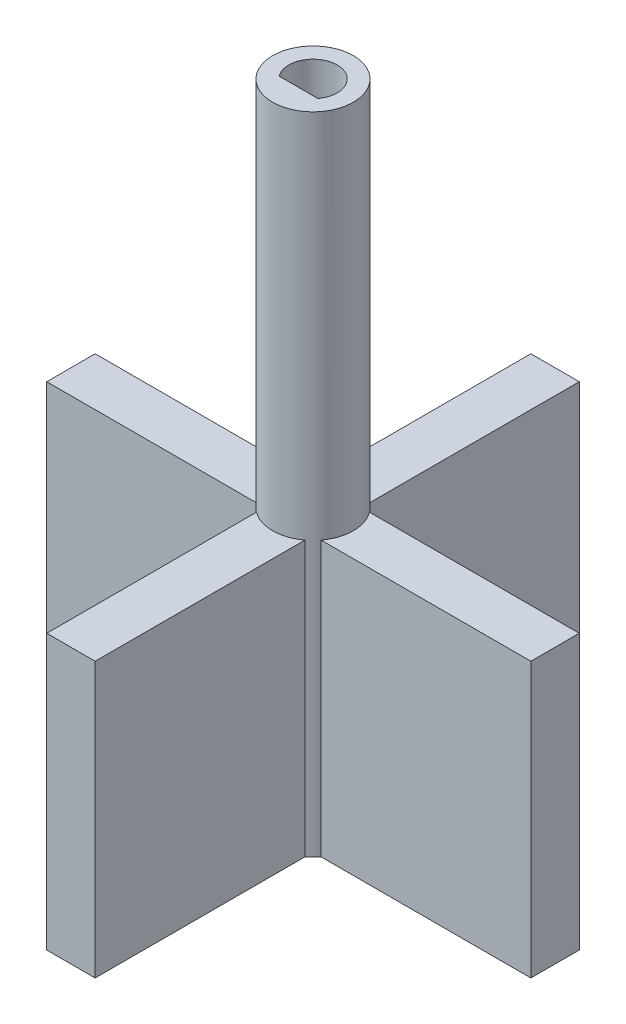
ISO-10303-21;
HEADER;
FILE_DESCRIPTION(('STEP AP214'),'2;1');
FILE_NAME('part.step','',(''),(''),'','','');
FILE_SCHEMA(('AUTOMOTIVE_DESIGN { 1 0 10303 214 1 1 1 1 }'));
ENDSEC;
DATA;
#1=APPLICATION_CONTEXT('core data for automotive mechanical design processes');
#2=APPLICATION_PROTOCOL_DEFINITION('international standard','automotive_design',2000,#1);
#3=PRODUCT_CONTEXT('',#1,'mechanical');
#4=PRODUCT('Part','Part','',(#3));
#5=PRODUCT_RELATED_PRODUCT_CATEGORY('part','',(#4));
#6=PRODUCT_DEFINITION_FORMATION('','',#4);
#7=PRODUCT_DEFINITION_CONTEXT('part definition',#1,'design');
#8=PRODUCT_DEFINITION('design','',#6,#7);
#9=PRODUCT_DEFINITION_SHAPE('','',#8);
#10=(LENGTH_UNIT() NAMED_UNIT(*) SI_UNIT(.MILLI.,.METRE.));
#11=(NAMED_UNIT(*) PLANE_ANGLE_UNIT() SI_UNIT($,.RADIAN.));
#12=(NAMED_UNIT(*) SI_UNIT($,.STERADIAN.) SOLID_ANGLE_UNIT());
#13=UNCERTAINTY_MEASURE_WITH_UNIT(LENGTH_MEASURE(1.E-05),#10,'distance_accuracy_value','');
#14=(GEOMETRIC_REPRESENTATION_CONTEXT(3) GLOBAL_UNCERTAINTY_ASSIGNED_CONTEXT((#13)) GLOBAL_UNIT_ASSIGNED_CONTEXT((#10,
#11,#12)) REPRESENTATION_CONTEXT('',''));
#15=CARTESIAN_POINT('',(0.,0.,0.));
#16=DIRECTION('',(0.,0.,1.));
#17=DIRECTION('',(1.,0.,0.));
#18=AXIS2_PLACEMENT_3D('',#15,#16,#17);
#19=CARTESIAN_POINT('',(0.,17.,0.));
#20=DIRECTION('',(0.,1.,0.));
#21=DIRECTION('',(0.,0.,1.));
#22=AXIS2_PLACEMENT_3D('',#19,#20,#21);
#23=PLANE('',#22);
#24=DIRECTION('',(1.,0.,0.));
#25=VECTOR('',#24,1.);
#26=CARTESIAN_POINT('',(0.,17.,0.6));
#27=LINE('',#26,#25);
#28=CARTESIAN_POINT('',(-15.,17.,0.600000000000001));
#29=VERTEX_POINT('',#28);
#30=CARTESIAN_POINT('',(-2.,17.,0.6));
#31=VERTEX_POINT('',#30);
#32=EDGE_CURVE('E191',#29,#31,#27,.T.);
#33=ORIENTED_EDGE('',*,*,#32,.T.);
#34=CARTESIAN_POINT('',(0.,17.,-0.9));
#35=DIRECTION('',(0.,1.,0.));
#36=DIRECTION('',(0.,0.,1.));
#37=AXIS2_PLACEMENT_3D('',#34,#35,#36);
#38=CIRCLE('',#37,2.5);
#39=CARTESIAN_POINT('',(-2.,17.,-2.4));
#40=VERTEX_POINT('',#39);
#41=EDGE_CURVE('E174',#31,#40,#38,.F.);
#42=ORIENTED_EDGE('',*,*,#41,.T.);
#43=DIRECTION('',(1.,0.,0.));
#44=VECTOR('',#43,1.);
#45=CARTESIAN_POINT('',(0.,17.,-2.4));
#46=LINE('',#45,#44);
#47=CARTESIAN_POINT('',(-15.,17.,-2.4));
#48=VERTEX_POINT('',#47);
#49=EDGE_CURVE('E353',#48,#40,#46,.T.);
#50=ORIENTED_EDGE('',*,*,#49,.F.);
#51=DIRECTION('',(0.,0.,1.));
#52=VECTOR('',#51,1.);
#53=CARTESIAN_POINT('',(-15.,17.,0.));
#54=LINE('',#53,#52);
#55=EDGE_CURVE('E197',#48,#29,#54,.T.);
#56=ORIENTED_EDGE('',*,*,#55,.T.);
#57=EDGE_LOOP('',(#33,#42,#50,#56));
#58=FACE_BOUND('',#57,.T.);
#59=ADVANCED_FACE('F45',(#58),#23,.T.);
#60=DIRECTION('',(0.,0.,-1.));
#61=VECTOR('',#60,1.);
#62=CARTESIAN_POINT('',(-1.5,17.,0.));
#63=LINE('',#62,#61);
#64=CARTESIAN_POINT('',(-1.5,17.,-2.9));
#65=VERTEX_POINT('',#64);
#66=CARTESIAN_POINT('',(-1.5,17.,-15.9));
#67=VERTEX_POINT('',#66);
#68=EDGE_CURVE('E349',#65,#67,#63,.T.);
#69=ORIENTED_EDGE('',*,*,#68,.F.);
#70=CARTESIAN_POINT('',(1.5,17.,-2.9));
#71=VERTEX_POINT('',#70);
#72=EDGE_CURVE('E391',#65,#71,#38,.F.);
#73=ORIENTED_EDGE('',*,*,#72,.T.);
#74=DIRECTION('',(0.,0.,-1.));
#75=VECTOR('',#74,1.);
#76=CARTESIAN_POINT('',(1.5,17.,0.));
#77=LINE('',#76,#75);
#78=CARTESIAN_POINT('',(1.5,17.,-15.9));
#79=VERTEX_POINT('',#78);
#80=EDGE_CURVE('E339',#71,#79,#77,.T.);
#81=ORIENTED_EDGE('',*,*,#80,.T.);
#82=DIRECTION('',(1.,0.,0.));
#83=VECTOR('',#82,1.);
#84=CARTESIAN_POINT('',(0.,17.,-15.9));
#85=LINE('',#84,#83);
#86=EDGE_CURVE('E342',#67,#79,#85,.T.);
#87=ORIENTED_EDGE('',*,*,#86,.F.);
#88=EDGE_LOOP('',(#69,#73,#81,#87));
#89=FACE_BOUND('',#88,.T.);
#90=ADVANCED_FACE('F436',(#89),#23,.T.);
#91=DIRECTION('',(1.,0.,0.));
#92=VECTOR('',#91,1.);
#93=CARTESIAN_POINT('',(0.,17.,-2.4));
#94=LINE('',#93,#92);
#95=CARTESIAN_POINT('',(2.,17.,-2.4));
#96=VERTEX_POINT('',#95);
#97=CARTESIAN_POINT('',(15.,17.,-2.4));
#98=VERTEX_POINT('',#97);
#99=EDGE_CURVE('E333',#96,#98,#94,.T.);
#100=ORIENTED_EDGE('',*,*,#99,.F.);
#101=CARTESIAN_POINT('',(2.,17.,0.6));
#102=VERTEX_POINT('',#101);
#103=EDGE_CURVE('E171',#96,#102,#38,.F.);
#104=ORIENTED_EDGE('',*,*,#103,.T.);
#105=DIRECTION('',(1.,0.,0.));
#106=VECTOR('',#105,1.);
#107=CARTESIAN_POINT('',(0.,17.,0.6));
#108=LINE('',#107,#106);
#109=CARTESIAN_POINT('',(15.,17.,0.599999999999999));
#110=VERTEX_POINT('',#109);
#111=EDGE_CURVE('E139',#102,#110,#108,.T.);
#112=ORIENTED_EDGE('',*,*,#111,.T.);
#113=DIRECTION('',(0.,0.,1.));
#114=VECTOR('',#113,1.);
#115=CARTESIAN_POINT('',(15.,17.,0.));
#116=LINE('',#115,#114);
#117=EDGE_CURVE('E327',#98,#110,#116,.T.);
#118=ORIENTED_EDGE('',*,*,#117,.F.);
#119=EDGE_LOOP('',(#100,#104,#112,#118));
#120=FACE_BOUND('',#119,.T.);
#121=ADVANCED_FACE('F331',(#120),#23,.T.);
#122=DIRECTION('',(0.,0.,-1.));
#123=VECTOR('',#122,1.);
#124=CARTESIAN_POINT('',(1.5,17.,0.));
#125=LINE('',#124,#123);
#126=CARTESIAN_POINT('',(1.5,17.,14.1));
#127=VERTEX_POINT('',#126);
#128=CARTESIAN_POINT('',(1.5,17.,1.1));
#129=VERTEX_POINT('',#128);
#130=EDGE_CURVE('E166',#127,#129,#125,.T.);
#131=ORIENTED_EDGE('',*,*,#130,.T.);
#132=CARTESIAN_POINT('',(-1.5,17.,1.1));
#133=VERTEX_POINT('',#132);
#134=EDGE_CURVE('E159',#129,#133,#38,.F.);
#135=ORIENTED_EDGE('',*,*,#134,.T.);
#136=DIRECTION('',(0.,0.,-1.));
#137=VECTOR('',#136,1.);
#138=CARTESIAN_POINT('',(-1.5,17.,0.));
#139=LINE('',#138,#137);
#140=CARTESIAN_POINT('',(-1.5,17.,14.1));
#141=VERTEX_POINT('',#140);
#142=EDGE_CURVE('E163',#141,#133,#139,.T.);
#143=ORIENTED_EDGE('',*,*,#142,.F.);
#144=DIRECTION('',(1.,0.,0.));
#145=VECTOR('',#144,1.);
#146=CARTESIAN_POINT('',(0.,17.,14.1));
#147=LINE('',#146,#145);
#148=EDGE_CURVE('E65',#141,#127,#147,.T.);
#149=ORIENTED_EDGE('',*,*,#148,.T.);
#150=EDGE_LOOP('',(#131,#135,#143,#149));
#151=FACE_BOUND('',#150,.T.);
#152=ADVANCED_FACE('F161',(#151),#23,.T.);
#153=CARTESIAN_POINT('',(0.,17.,-0.9));
#154=DIRECTION('',(0.,-1.,0.));
#155=DIRECTION('',(0.,0.,-1.));
#156=AXIS2_PLACEMENT_3D('',#153,#154,#155);
#157=CYLINDRICAL_SURFACE('',#156,1.5);
#158=CARTESIAN_POINT('',(0.,0.,-0.9));
#159=DIRECTION('',(0.,1.,0.));
#160=DIRECTION('',(0.,0.,1.));
#161=AXIS2_PLACEMENT_3D('',#158,#159,#160);
#162=CIRCLE('',#161,1.5);
#163=CARTESIAN_POINT('',(1.2,0.,0.));
#164=VERTEX_POINT('',#163);
#165=CARTESIAN_POINT('',(-1.2,0.,0.));
#166=VERTEX_POINT('',#165);
#167=EDGE_CURVE('E260',#164,#166,#162,.T.);
#168=ORIENTED_EDGE('',*,*,#167,.F.);
#169=DIRECTION('',(0.,-1.,0.));
#170=VECTOR('',#169,1.);
#171=CARTESIAN_POINT('',(1.2,17.,0.));
#172=LINE('',#171,#170);
#173=CARTESIAN_POINT('',(1.2,40.,0.));
#174=VERTEX_POINT('',#173);
#175=EDGE_CURVE('E11',#174,#164,#172,.T.);
#176=ORIENTED_EDGE('',*,*,#175,.F.);
#177=CARTESIAN_POINT('',(0.,40.,-0.9));
#178=DIRECTION('',(0.,1.,0.));
#179=DIRECTION('',(0.,0.,1.));
#180=AXIS2_PLACEMENT_3D('',#177,#178,#179);
#181=CIRCLE('',#180,1.5);
#182=CARTESIAN_POINT('',(-1.2,40.,0.));
#183=VERTEX_POINT('',#182);
#184=EDGE_CURVE('E417',#174,#183,#181,.T.);
#185=ORIENTED_EDGE('',*,*,#184,.T.);
#186=DIRECTION('',(0.,-1.,0.));
#187=VECTOR('',#186,1.);
#188=CARTESIAN_POINT('',(-1.2,17.,0.));
#189=LINE('',#188,#187);
#190=EDGE_CURVE('E56',#183,#166,#189,.T.);
#191=ORIENTED_EDGE('',*,*,#190,.T.);
#192=EDGE_LOOP('',(#168,#176,#185,#191));
#193=FACE_BOUND('',#192,.T.);
#194=ADVANCED_FACE('F445',(#193),#157,.F.);
#195=CARTESIAN_POINT('',(0.,17.,0.6));
#196=DIRECTION('',(0.,0.,-1.));
#197=DIRECTION('',(-1.,0.,0.));
#198=AXIS2_PLACEMENT_3D('',#195,#196,#197);
#199=PLANE('',#198);
#200=DIRECTION('',(1.,0.,0.));
#201=VECTOR('',#200,1.);
#202=CARTESIAN_POINT('',(0.,0.,0.6));
#203=LINE('',#202,#201);
#204=CARTESIAN_POINT('',(2.,0.,0.6));
#205=VERTEX_POINT('',#204);
#206=CARTESIAN_POINT('',(15.,0.,0.599999999999999));
#207=VERTEX_POINT('',#206);
#208=EDGE_CURVE('E208',#205,#207,#203,.T.);
#209=ORIENTED_EDGE('',*,*,#208,.T.);
#210=DIRECTION('',(0.,-1.,0.));
#211=VECTOR('',#210,1.);
#212=CARTESIAN_POINT('',(15.,17.,0.599999999999999));
#213=LINE('',#212,#211);
#214=EDGE_CURVE('E307',#110,#207,#213,.T.);
#215=ORIENTED_EDGE('',*,*,#214,.F.);
#216=ORIENTED_EDGE('',*,*,#111,.F.);
#217=DIRECTION('',(0.,-1.,0.));
#218=VECTOR('',#217,1.);
#219=CARTESIAN_POINT('',(2.,17.,0.6));
#220=LINE('',#219,#218);
#221=EDGE_CURVE('E49',#102,#205,#220,.T.);
#222=ORIENTED_EDGE('',*,*,#221,.T.);
#223=EDGE_LOOP('',(#209,#215,#216,#222));
#224=FACE_BOUND('',#223,.T.);
#225=ADVANCED_FACE('F47',(#224),#199,.F.);
#226=CARTESIAN_POINT('',(15.,17.,0.));
#227=DIRECTION('',(1.,0.,0.));
#228=DIRECTION('',(0.,0.,-1.));
#229=AXIS2_PLACEMENT_3D('',#226,#227,#228);
#230=PLANE('',#229);
#231=DIRECTION('',(0.,0.,1.));
#232=VECTOR('',#231,1.);
#233=CARTESIAN_POINT('',(15.,0.,0.));
#234=LINE('',#233,#232);
#235=CARTESIAN_POINT('',(15.,0.,-2.4));
#236=VERTEX_POINT('',#235);
#237=EDGE_CURVE('E212',#236,#207,#234,.T.);
#238=ORIENTED_EDGE('',*,*,#237,.F.);
#239=DIRECTION('',(0.,-1.,0.));
#240=VECTOR('',#239,1.);
#241=CARTESIAN_POINT('',(15.,17.,-2.4));
#242=LINE('',#241,#240);
#243=EDGE_CURVE('E305',#98,#236,#242,.T.);
#244=ORIENTED_EDGE('',*,*,#243,.F.);
#245=ORIENTED_EDGE('',*,*,#117,.T.);
#246=ORIENTED_EDGE('',*,*,#214,.T.);
#247=EDGE_LOOP('',(#238,#244,#245,#246));
#248=FACE_BOUND('',#247,.T.);
#249=ADVANCED_FACE('F326',(#248),#230,.T.);
#250=CARTESIAN_POINT('',(0.,17.,-2.4));
#251=DIRECTION('',(0.,0.,-1.));
#252=DIRECTION('',(-1.,0.,0.));
#253=AXIS2_PLACEMENT_3D('',#250,#251,#252);
#254=PLANE('',#253);
#255=DIRECTION('',(1.,0.,0.));
#256=VECTOR('',#255,1.);
#257=CARTESIAN_POINT('',(0.,0.,-2.4));
#258=LINE('',#257,#256);
#259=CARTESIAN_POINT('',(2.,0.,-2.4));
#260=VERTEX_POINT('',#259);
#261=EDGE_CURVE('E216',#260,#236,#258,.T.);
#262=ORIENTED_EDGE('',*,*,#261,.F.);
#263=DIRECTION('',(0.,-1.,0.));
#264=VECTOR('',#263,1.);
#265=CARTESIAN_POINT('',(2.,17.,-2.4));
#266=LINE('',#265,#264);
#267=EDGE_CURVE('E302',#96,#260,#266,.T.);
#268=ORIENTED_EDGE('',*,*,#267,.F.);
#269=ORIENTED_EDGE('',*,*,#99,.T.);
#270=ORIENTED_EDGE('',*,*,#243,.T.);
#271=EDGE_LOOP('',(#262,#268,#269,#270));
#272=FACE_BOUND('',#271,.T.);
#273=ADVANCED_FACE('F337',(#272),#254,.T.);
#274=CARTESIAN_POINT('',(1.5,17.,0.));
#275=DIRECTION('',(-1.,0.,0.));
#276=DIRECTION('',(0.,0.,1.));
#277=AXIS2_PLACEMENT_3D('',#274,#275,#276);
#278=PLANE('',#277);
#279=DIRECTION('',(0.,0.,-1.));
#280=VECTOR('',#279,1.);
#281=CARTESIAN_POINT('',(1.5,0.,0.));
#282=LINE('',#281,#280);
#283=CARTESIAN_POINT('',(1.5,0.,-2.9));
#284=VERTEX_POINT('',#283);
#285=CARTESIAN_POINT('',(1.5,0.,-15.9));
#286=VERTEX_POINT('',#285);
#287=EDGE_CURVE('E223',#284,#286,#282,.T.);
#288=ORIENTED_EDGE('',*,*,#287,.T.);
#289=DIRECTION('',(0.,-1.,0.));
#290=VECTOR('',#289,1.);
#291=CARTESIAN_POINT('',(1.5,17.,-15.9));
#292=LINE('',#291,#290);
#293=EDGE_CURVE('E295',#79,#286,#292,.T.);
#294=ORIENTED_EDGE('',*,*,#293,.F.);
#295=ORIENTED_EDGE('',*,*,#80,.F.);
#296=DIRECTION('',(0.,-1.,0.));
#297=VECTOR('',#296,1.);
#298=CARTESIAN_POINT('',(1.5,17.,-2.9));
#299=LINE('',#298,#297);
#300=EDGE_CURVE('E298',#71,#284,#299,.T.);
#301=ORIENTED_EDGE('',*,*,#300,.T.);
#302=EDGE_LOOP('',(#288,#294,#295,#301));
#303=FACE_BOUND('',#302,.T.);
#304=ADVANCED_FACE('F408',(#303),#278,.F.);
#305=CARTESIAN_POINT('',(0.,17.,-15.9));
#306=DIRECTION('',(0.,0.,-1.));
#307=DIRECTION('',(-1.,0.,0.));
#308=AXIS2_PLACEMENT_3D('',#305,#306,#307);
#309=PLANE('',#308);
#310=DIRECTION('',(1.,0.,0.));
#311=VECTOR('',#310,1.);
#312=CARTESIAN_POINT('',(0.,0.,-15.9));
#313=LINE('',#312,#311);
#314=CARTESIAN_POINT('',(-1.5,0.,-15.9));
#315=VERTEX_POINT('',#314);
#316=EDGE_CURVE('E227',#315,#286,#313,.T.);
#317=ORIENTED_EDGE('',*,*,#316,.F.);
#318=DIRECTION('',(0.,-1.,0.));
#319=VECTOR('',#318,1.);
#320=CARTESIAN_POINT('',(-1.5,17.,-15.9));
#321=LINE('',#320,#319);
#322=EDGE_CURVE('E292',#67,#315,#321,.T.);
#323=ORIENTED_EDGE('',*,*,#322,.F.);
#324=ORIENTED_EDGE('',*,*,#86,.T.);
#325=ORIENTED_EDGE('',*,*,#293,.T.);
#326=EDGE_LOOP('',(#317,#323,#324,#325));
#327=FACE_BOUND('',#326,.T.);
#328=ADVANCED_FACE('F404',(#327),#309,.T.);
#329=CARTESIAN_POINT('',(-1.5,17.,0.));
#330=DIRECTION('',(-1.,0.,0.));
#331=DIRECTION('',(0.,0.,1.));
#332=AXIS2_PLACEMENT_3D('',#329,#330,#331);
#333=PLANE('',#332);
#334=DIRECTION('',(0.,0.,-1.));
#335=VECTOR('',#334,1.);
#336=CARTESIAN_POINT('',(-1.5,0.,0.));
#337=LINE('',#336,#335);
#338=CARTESIAN_POINT('',(-1.5,0.,-2.9));
#339=VERTEX_POINT('',#338);
#340=EDGE_CURVE('E231',#339,#315,#337,.T.);
#341=ORIENTED_EDGE('',*,*,#340,.F.);
#342=DIRECTION('',(0.,-1.,0.));
#343=VECTOR('',#342,1.);
#344=CARTESIAN_POINT('',(-1.5,17.,-2.9));
#345=LINE('',#344,#343);
#346=EDGE_CURVE('E289',#65,#339,#345,.T.);
#347=ORIENTED_EDGE('',*,*,#346,.F.);
#348=ORIENTED_EDGE('',*,*,#68,.T.);
#349=ORIENTED_EDGE('',*,*,#322,.T.);
#350=EDGE_LOOP('',(#341,#347,#348,#349));
#351=FACE_BOUND('',#350,.T.);
#352=ADVANCED_FACE('F399',(#351),#333,.T.);
#353=CARTESIAN_POINT('',(0.,17.,-2.4));
#354=DIRECTION('',(0.,0.,-1.));
#355=DIRECTION('',(-1.,0.,0.));
#356=AXIS2_PLACEMENT_3D('',#353,#354,#355);
#357=PLANE('',#356);
#358=DIRECTION('',(1.,0.,0.));
#359=VECTOR('',#358,1.);
#360=CARTESIAN_POINT('',(0.,0.,-2.4));
#361=LINE('',#360,#359);
#362=CARTESIAN_POINT('',(-15.,0.,-2.4));
#363=VERTEX_POINT('',#362);
#364=CARTESIAN_POINT('',(-2.,0.,-2.4));
#365=VERTEX_POINT('',#364);
#366=EDGE_CURVE('E239',#363,#365,#361,.T.);
#367=ORIENTED_EDGE('',*,*,#366,.F.);
#368=DIRECTION('',(0.,-1.,0.));
#369=VECTOR('',#368,1.);
#370=CARTESIAN_POINT('',(-15.,17.,-2.4));
#371=LINE('',#370,#369);
#372=EDGE_CURVE('E283',#48,#363,#371,.T.);
#373=ORIENTED_EDGE('',*,*,#372,.F.);
#374=ORIENTED_EDGE('',*,*,#49,.T.);
#375=DIRECTION('',(0.,-1.,0.));
#376=VECTOR('',#375,1.);
#377=CARTESIAN_POINT('',(-2.,17.,-2.4));
#378=LINE('',#377,#376);
#379=EDGE_CURVE('E286',#40,#365,#378,.T.);
#380=ORIENTED_EDGE('',*,*,#379,.T.);
#381=EDGE_LOOP('',(#367,#373,#374,#380));
#382=FACE_BOUND('',#381,.T.);
#383=ADVANCED_FACE('F395',(#382),#357,.T.);
#384=CARTESIAN_POINT('',(-15.,17.,0.));
#385=DIRECTION('',(1.,0.,0.));
#386=DIRECTION('',(0.,0.,-1.));
#387=AXIS2_PLACEMENT_3D('',#384,#385,#386);
#388=PLANE('',#387);
#389=DIRECTION('',(0.,0.,1.));
#390=VECTOR('',#389,1.);
#391=CARTESIAN_POINT('',(-15.,0.,0.));
#392=LINE('',#391,#390);
#393=CARTESIAN_POINT('',(-15.,0.,0.600000000000001));
#394=VERTEX_POINT('',#393);
#395=EDGE_CURVE('E243',#363,#394,#392,.T.);
#396=ORIENTED_EDGE('',*,*,#395,.T.);
#397=DIRECTION('',(0.,-1.,0.));
#398=VECTOR('',#397,1.);
#399=CARTESIAN_POINT('',(-15.,17.,0.600000000000001));
#400=LINE('',#399,#398);
#401=EDGE_CURVE('E279',#29,#394,#400,.T.);
#402=ORIENTED_EDGE('',*,*,#401,.F.);
#403=ORIENTED_EDGE('',*,*,#55,.F.);
#404=ORIENTED_EDGE('',*,*,#372,.T.);
#405=EDGE_LOOP('',(#396,#402,#403,#404));
#406=FACE_BOUND('',#405,.T.);
#407=ADVANCED_FACE('F365',(#406),#388,.F.);
#408=CARTESIAN_POINT('',(0.,17.,0.6));
#409=DIRECTION('',(0.,0.,-1.));
#410=DIRECTION('',(-1.,0.,0.));
#411=AXIS2_PLACEMENT_3D('',#408,#409,#410);
#412=PLANE('',#411);
#413=DIRECTION('',(1.,0.,0.));
#414=VECTOR('',#413,1.);
#415=CARTESIAN_POINT('',(0.,0.,0.6));
#416=LINE('',#415,#414);
#417=CARTESIAN_POINT('',(-2.,0.,0.6));
#418=VERTEX_POINT('',#417);
#419=EDGE_CURVE('E246',#394,#418,#416,.T.);
#420=ORIENTED_EDGE('',*,*,#419,.T.);
#421=DIRECTION('',(0.,-1.,0.));
#422=VECTOR('',#421,1.);
#423=CARTESIAN_POINT('',(-2.,17.,0.6));
#424=LINE('',#423,#422);
#425=EDGE_CURVE('E186',#31,#418,#424,.T.);
#426=ORIENTED_EDGE('',*,*,#425,.F.);
#427=ORIENTED_EDGE('',*,*,#32,.F.);
#428=ORIENTED_EDGE('',*,*,#401,.T.);
#429=EDGE_LOOP('',(#420,#426,#427,#428));
#430=FACE_BOUND('',#429,.T.);
#431=ADVANCED_FACE('F369',(#430),#412,.F.);
#432=CARTESIAN_POINT('',(0.,17.,-0.9));
#433=DIRECTION('',(0.,-1.,0.));
#434=DIRECTION('',(0.,0.,-1.));
#435=AXIS2_PLACEMENT_3D('',#432,#433,#434);
#436=CYLINDRICAL_SURFACE('',#435,2.5);
#437=CARTESIAN_POINT('',(0.,0.,-0.9));
#438=DIRECTION('',(0.,1.,0.));
#439=DIRECTION('',(0.,0.,1.));
#440=AXIS2_PLACEMENT_3D('',#437,#438,#439);
#441=CIRCLE('',#440,2.5);
#442=CARTESIAN_POINT('',(-1.5,0.,1.1));
#443=VERTEX_POINT('',#442);
#444=EDGE_CURVE('E181',#418,#443,#441,.T.);
#445=ORIENTED_EDGE('',*,*,#444,.T.);
#446=DIRECTION('',(0.,-1.,0.));
#447=VECTOR('',#446,1.);
#448=CARTESIAN_POINT('',(-1.5,17.,1.1));
#449=LINE('',#448,#447);
#450=EDGE_CURVE('E176',#133,#443,#449,.T.);
#451=ORIENTED_EDGE('',*,*,#450,.F.);
#452=ORIENTED_EDGE('',*,*,#134,.F.);
#453=DIRECTION('',(0.,-1.,0.));
#454=VECTOR('',#453,1.);
#455=CARTESIAN_POINT('',(1.5,17.,1.1));
#456=LINE('',#455,#454);
#457=CARTESIAN_POINT('',(1.5,0.,1.1));
#458=VERTEX_POINT('',#457);
#459=EDGE_CURVE('E203',#129,#458,#456,.T.);
#460=ORIENTED_EDGE('',*,*,#459,.T.);
#461=CARTESIAN_POINT('',(0.,0.,-0.9));
#462=DIRECTION('',(0.,1.,0.));
#463=DIRECTION('',(0.,0.,1.));
#464=AXIS2_PLACEMENT_3D('',#461,#462,#463);
#465=CIRCLE('',#464,2.5);
#466=EDGE_CURVE('E204',#458,#205,#465,.T.);
#467=ORIENTED_EDGE('',*,*,#466,.T.);
#468=ORIENTED_EDGE('',*,*,#221,.F.);
#469=ORIENTED_EDGE('',*,*,#103,.F.);
#470=ORIENTED_EDGE('',*,*,#267,.T.);
#471=CARTESIAN_POINT('',(0.,0.,-0.9));
#472=DIRECTION('',(0.,1.,0.));
#473=DIRECTION('',(0.,0.,1.));
#474=AXIS2_PLACEMENT_3D('',#471,#472,#473);
#475=CIRCLE('',#474,2.5);
#476=EDGE_CURVE('E220',#260,#284,#475,.T.);
#477=ORIENTED_EDGE('',*,*,#476,.T.);
#478=ORIENTED_EDGE('',*,*,#300,.F.);
#479=ORIENTED_EDGE('',*,*,#72,.F.);
#480=ORIENTED_EDGE('',*,*,#346,.T.);
#481=CARTESIAN_POINT('',(0.,0.,-0.9));
#482=DIRECTION('',(0.,1.,0.));
#483=DIRECTION('',(0.,0.,1.));
#484=AXIS2_PLACEMENT_3D('',#481,#482,#483);
#485=CIRCLE('',#484,2.5);
#486=EDGE_CURVE('E235',#339,#365,#485,.T.);
#487=ORIENTED_EDGE('',*,*,#486,.T.);
#488=ORIENTED_EDGE('',*,*,#379,.F.);
#489=ORIENTED_EDGE('',*,*,#41,.F.);
#490=ORIENTED_EDGE('',*,*,#425,.T.);
#491=EDGE_LOOP('',(#445,#451,#452,#460,#467,#468,#469,#470,#477,#478,#479,#480,#487,#488,#489,#490));
#492=FACE_BOUND('',#491,.T.);
#493=CARTESIAN_POINT('',(0.,40.,-0.9));
#494=DIRECTION('',(0.,1.,0.));
#495=DIRECTION('',(0.,0.,1.));
#496=AXIS2_PLACEMENT_3D('',#493,#494,#495);
#497=CIRCLE('',#496,2.5);
#498=CARTESIAN_POINT('',(0.,40.,1.6));
#499=VERTEX_POINT('',#498);
#500=EDGE_CURVE('E420',#499,#499,#497,.T.);
#501=ORIENTED_EDGE('',*,*,#500,.F.);
#502=EDGE_LOOP('',(#501));
#503=FACE_BOUND('',#502,.T.);
#504=ADVANCED_FACE('F177',(#492,#503),#436,.T.);
#505=CARTESIAN_POINT('',(-1.5,17.,0.));
#506=DIRECTION('',(-1.,0.,0.));
#507=DIRECTION('',(0.,0.,1.));
#508=AXIS2_PLACEMENT_3D('',#505,#506,#507);
#509=PLANE('',#508);
#510=DIRECTION('',(0.,0.,-1.));
#511=VECTOR('',#510,1.);
#512=CARTESIAN_POINT('',(-1.5,0.,0.));
#513=LINE('',#512,#511);
#514=CARTESIAN_POINT('',(-1.5,0.,14.1));
#515=VERTEX_POINT('',#514);
#516=EDGE_CURVE('E251',#515,#443,#513,.T.);
#517=ORIENTED_EDGE('',*,*,#516,.F.);
#518=DIRECTION('',(0.,-1.,0.));
#519=VECTOR('',#518,1.);
#520=CARTESIAN_POINT('',(-1.5,17.,14.1));
#521=LINE('',#520,#519);
#522=EDGE_CURVE('E187',#141,#515,#521,.T.);
#523=ORIENTED_EDGE('',*,*,#522,.F.);
#524=ORIENTED_EDGE('',*,*,#142,.T.);
#525=ORIENTED_EDGE('',*,*,#450,.T.);
#526=EDGE_LOOP('',(#517,#523,#524,#525));
#527=FACE_BOUND('',#526,.T.);
#528=ADVANCED_FACE('F189',(#527),#509,.T.);
#529=CARTESIAN_POINT('',(0.,17.,14.1));
#530=DIRECTION('',(0.,0.,-1.));
#531=DIRECTION('',(-1.,0.,0.));
#532=AXIS2_PLACEMENT_3D('',#529,#530,#531);
#533=PLANE('',#532);
#534=DIRECTION('',(1.,0.,0.));
#535=VECTOR('',#534,1.);
#536=CARTESIAN_POINT('',(0.,0.,14.1));
#537=LINE('',#536,#535);
#538=CARTESIAN_POINT('',(1.5,0.,14.1));
#539=VERTEX_POINT('',#538);
#540=EDGE_CURVE('E254',#515,#539,#537,.T.);
#541=ORIENTED_EDGE('',*,*,#540,.T.);
#542=DIRECTION('',(0.,-1.,0.));
#543=VECTOR('',#542,1.);
#544=CARTESIAN_POINT('',(1.5,17.,14.1));
#545=LINE('',#544,#543);
#546=EDGE_CURVE('E271',#127,#539,#545,.T.);
#547=ORIENTED_EDGE('',*,*,#546,.F.);
#548=ORIENTED_EDGE('',*,*,#148,.F.);
#549=ORIENTED_EDGE('',*,*,#522,.T.);
#550=EDGE_LOOP('',(#541,#547,#548,#549));
#551=FACE_BOUND('',#550,.T.);
#552=ADVANCED_FACE('F374',(#551),#533,.F.);
#553=CARTESIAN_POINT('',(1.5,17.,0.));
#554=DIRECTION('',(-1.,0.,0.));
#555=DIRECTION('',(0.,0.,1.));
#556=AXIS2_PLACEMENT_3D('',#553,#554,#555);
#557=PLANE('',#556);
#558=DIRECTION('',(0.,0.,-1.));
#559=VECTOR('',#558,1.);
#560=CARTESIAN_POINT('',(1.5,0.,0.));
#561=LINE('',#560,#559);
#562=EDGE_CURVE('E257',#539,#458,#561,.T.);
#563=ORIENTED_EDGE('',*,*,#562,.T.);
#564=ORIENTED_EDGE('',*,*,#459,.F.);
#565=ORIENTED_EDGE('',*,*,#130,.F.);
#566=ORIENTED_EDGE('',*,*,#546,.T.);
#567=EDGE_LOOP('',(#563,#564,#565,#566));
#568=FACE_BOUND('',#567,.T.);
#569=ADVANCED_FACE('F376',(#568),#557,.F.);
#570=CARTESIAN_POINT('',(0.,17.,0.));
#571=DIRECTION('',(0.,0.,-1.));
#572=DIRECTION('',(-1.,0.,0.));
#573=AXIS2_PLACEMENT_3D('',#570,#571,#572);
#574=PLANE('',#573);
#575=DIRECTION('',(1.,0.,0.));
#576=VECTOR('',#575,1.);
#577=CARTESIAN_POINT('',(0.,0.,0.));
#578=LINE('',#577,#576);
#579=EDGE_CURVE('E263',#166,#164,#578,.T.);
#580=ORIENTED_EDGE('',*,*,#579,.F.);
#581=ORIENTED_EDGE('',*,*,#190,.F.);
#582=DIRECTION('',(1.,0.,0.));
#583=VECTOR('',#582,1.);
#584=CARTESIAN_POINT('',(0.,40.,0.));
#585=LINE('',#584,#583);
#586=EDGE_CURVE('E172',#183,#174,#585,.T.);
#587=ORIENTED_EDGE('',*,*,#586,.T.);
#588=ORIENTED_EDGE('',*,*,#175,.T.);
#589=EDGE_LOOP('',(#580,#581,#587,#588));
#590=FACE_BOUND('',#589,.T.);
#591=ADVANCED_FACE('F565',(#590),#574,.T.);
#592=CARTESIAN_POINT('',(0.,0.,0.));
#593=DIRECTION('',(0.,1.,0.));
#594=DIRECTION('',(0.,0.,1.));
#595=AXIS2_PLACEMENT_3D('',#592,#593,#594);
#596=PLANE('',#595);
#597=ORIENTED_EDGE('',*,*,#444,.F.);
#598=ORIENTED_EDGE('',*,*,#419,.F.);
#599=ORIENTED_EDGE('',*,*,#395,.F.);
#600=ORIENTED_EDGE('',*,*,#366,.T.);
#601=ORIENTED_EDGE('',*,*,#486,.F.);
#602=ORIENTED_EDGE('',*,*,#340,.T.);
#603=ORIENTED_EDGE('',*,*,#316,.T.);
#604=ORIENTED_EDGE('',*,*,#287,.F.);
#605=ORIENTED_EDGE('',*,*,#476,.F.);
#606=ORIENTED_EDGE('',*,*,#261,.T.);
#607=ORIENTED_EDGE('',*,*,#237,.T.);
#608=ORIENTED_EDGE('',*,*,#208,.F.);
#609=ORIENTED_EDGE('',*,*,#466,.F.);
#610=ORIENTED_EDGE('',*,*,#562,.F.);
#611=ORIENTED_EDGE('',*,*,#540,.F.);
#612=ORIENTED_EDGE('',*,*,#516,.T.);
#613=EDGE_LOOP('',(#597,#598,#599,#600,#601,#602,#603,#604,#605,#606,#607,#608,#609,#610,#611,#612));
#614=FACE_BOUND('',#613,.T.);
#615=ORIENTED_EDGE('',*,*,#167,.T.);
#616=ORIENTED_EDGE('',*,*,#579,.T.);
#617=EDGE_LOOP('',(#615,#616));
#618=FACE_BOUND('',#617,.T.);
#619=ADVANCED_FACE('F321',(#614,#618),#596,.F.);
#620=CARTESIAN_POINT('',(0.,40.,0.));
#621=DIRECTION('',(0.,1.,0.));
#622=DIRECTION('',(0.,0.,1.));
#623=AXIS2_PLACEMENT_3D('',#620,#621,#622);
#624=PLANE('',#623);
#625=ORIENTED_EDGE('',*,*,#500,.T.);
#626=EDGE_LOOP('',(#625));
#627=FACE_BOUND('',#626,.T.);
#628=ORIENTED_EDGE('',*,*,#184,.F.);
#629=ORIENTED_EDGE('',*,*,#586,.F.);
#630=EDGE_LOOP('',(#628,#629));
#631=FACE_BOUND('',#630,.T.);
#632=ADVANCED_FACE('F425',(#627,#631),#624,.T.);
#633=CLOSED_SHELL('',(#59,#90,#121,#152,#194,#225,#249,#273,#304,#328,#352,#383,#407,#431,#504,
#528,#552,#569,#591,#619,#632));
#634=MANIFOLD_SOLID_BREP('B2',#633);
#635=ADVANCED_BREP_SHAPE_REPRESENTATION('',(#18,#634),#14);
#636=SHAPE_DEFINITION_REPRESENTATION(#9,#635);
ENDSEC;
END-ISO-10303-21;
